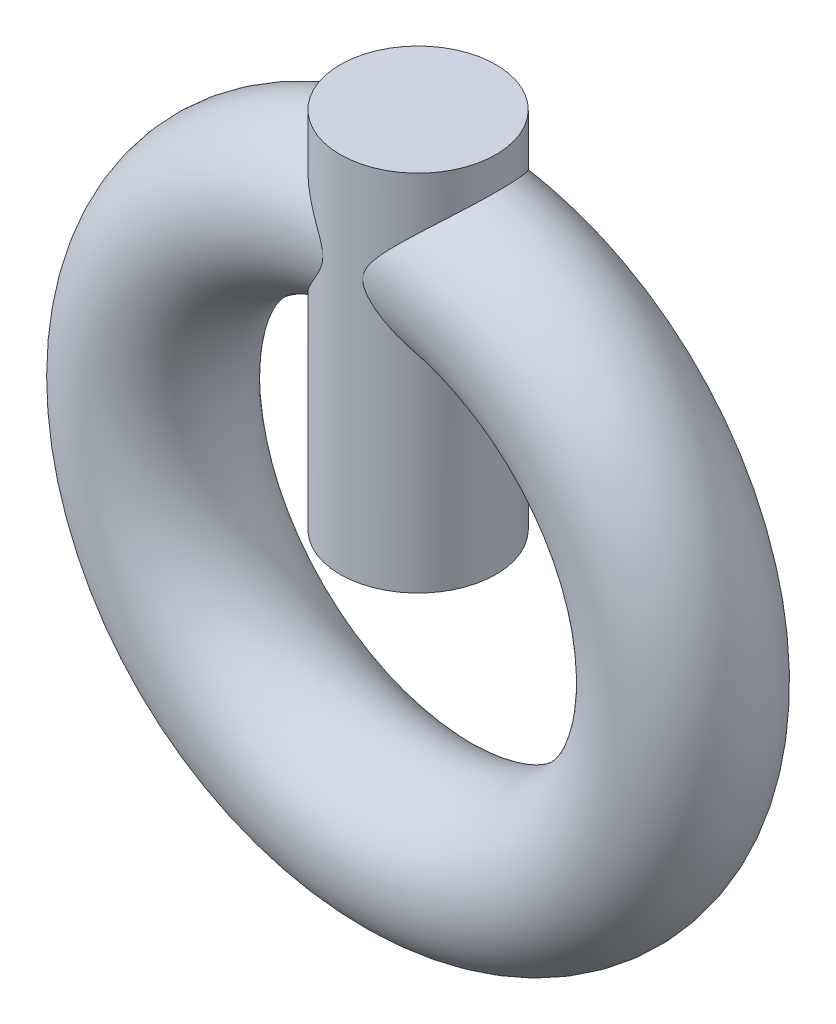
ISO-10303-21;
HEADER;
FILE_DESCRIPTION(('STEP AP214'),'2;1');
FILE_NAME('part.step','',(''),(''),'','','');
FILE_SCHEMA(('AUTOMOTIVE_DESIGN { 1 0 10303 214 1 1 1 1 }'));
ENDSEC;
DATA;
#1=APPLICATION_CONTEXT('core data for automotive mechanical design processes');
#2=APPLICATION_PROTOCOL_DEFINITION('international standard','automotive_design',2000,#1);
#3=PRODUCT_CONTEXT('',#1,'mechanical');
#4=PRODUCT('Part','Part','',(#3));
#5=PRODUCT_RELATED_PRODUCT_CATEGORY('part','',(#4));
#6=PRODUCT_DEFINITION_FORMATION('','',#4);
#7=PRODUCT_DEFINITION_CONTEXT('part definition',#1,'design');
#8=PRODUCT_DEFINITION('design','',#6,#7);
#9=PRODUCT_DEFINITION_SHAPE('','',#8);
#10=(LENGTH_UNIT() NAMED_UNIT(*) SI_UNIT(.MILLI.,.METRE.));
#11=(NAMED_UNIT(*) PLANE_ANGLE_UNIT() SI_UNIT($,.RADIAN.));
#12=(NAMED_UNIT(*) SI_UNIT($,.STERADIAN.) SOLID_ANGLE_UNIT());
#13=UNCERTAINTY_MEASURE_WITH_UNIT(LENGTH_MEASURE(1.E-05),#10,'distance_accuracy_value','');
#14=(GEOMETRIC_REPRESENTATION_CONTEXT(3) GLOBAL_UNCERTAINTY_ASSIGNED_CONTEXT((#13)) GLOBAL_UNIT_ASSIGNED_CONTEXT((#10,
#11,#12)) REPRESENTATION_CONTEXT('',''));
#15=CARTESIAN_POINT('',(0.,0.,0.));
#16=DIRECTION('',(0.,0.,1.));
#17=DIRECTION('',(1.,0.,0.));
#18=AXIS2_PLACEMENT_3D('',#15,#16,#17);
#19=CARTESIAN_POINT('',(0.,7.,0.));
#20=DIRECTION('',(0.,-1.,0.));
#21=DIRECTION('',(0.,0.,-1.));
#22=AXIS2_PLACEMENT_3D('',#19,#20,#21);
#23=CYLINDRICAL_SURFACE('',#22,1.5);
#24=CARTESIAN_POINT('',(1.01046878833553,4.0409402321982,-1.10858145059809));
#25=CARTESIAN_POINT('',(1.04253861403964,3.99718261907201,-1.07934999294081));
#26=CARTESIAN_POINT('',(1.07384523440462,3.95409877128989,-1.04826978071052));
#27=CARTESIAN_POINT('',(1.13460628607274,3.86960763249616,-0.982183834880756));
#28=CARTESIAN_POINT('',(1.16405987732708,3.82820110486405,-0.947176340625828));
#29=CARTESIAN_POINT('',(1.22059699837738,3.74779553809779,-0.873101553256515));
#30=CARTESIAN_POINT('',(1.24768922005671,3.70878784025348,-0.834050416786176));
#31=CARTESIAN_POINT('',(1.29910421629291,3.63387607875015,-0.751459973356823));
#32=CARTESIAN_POINT('',(1.32343021407299,3.59796841491036,-0.707926004961618));
#33=CARTESIAN_POINT('',(1.36717233241729,3.53266373744631,-0.61897616326386));
#34=CARTESIAN_POINT('',(1.38680590927656,3.50299409445297,-0.573871314648189));
#35=CARTESIAN_POINT('',(1.42229648669586,3.44885801260664,-0.479192662383965));
#36=CARTESIAN_POINT('',(1.43815401901551,3.42439084117014,-0.429619489342059));
#37=CARTESIAN_POINT('',(1.4652501338492,3.38228898204289,-0.325525979334886));
#38=CARTESIAN_POINT('',(1.47642311678332,3.36475151717711,-0.270947637754399));
#39=CARTESIAN_POINT('',(1.49264323056097,3.33920592892252,-0.158755897969195));
#40=CARTESIAN_POINT('',(1.49770508959985,3.33117489534948,-0.1011501474275));
#41=CARTESIAN_POINT('',(1.50081675793517,3.32624169756845,0.0066524682189837));
#42=CARTESIAN_POINT('',(1.49974558770159,3.32794438232444,0.0567628636124822));
#43=CARTESIAN_POINT('',(1.49271598914985,3.33907150040854,0.155778231380171));
#44=CARTESIAN_POINT('',(1.48675330751348,3.34850265386789,0.204682116521854));
#45=CARTESIAN_POINT('',(1.46916975711011,3.37612854019577,0.307746404014957));
#46=CARTESIAN_POINT('',(1.45678011802418,3.3955086773874,0.361450054367792));
#47=CARTESIAN_POINT('',(1.42729879779463,3.44114207411111,0.464436649979879));
#48=CARTESIAN_POINT('',(1.41019905549501,3.46740711312146,0.513711822571282));
#49=CARTESIAN_POINT('',(1.36218913682484,3.54026693500417,0.63285053832));
#50=CARTESIAN_POINT('',(1.3287845710363,3.59022073357271,0.699626369605038));
#51=CARTESIAN_POINT('',(1.25580939218595,3.69720074255347,0.823486931462728));
#52=CARTESIAN_POINT('',(1.2162195826254,3.75424885442823,0.88054029432956));
#53=CARTESIAN_POINT('',(1.14020165507297,3.86183045566709,0.976187396833687));
#54=CARTESIAN_POINT('',(1.10453761585232,3.91162426077001,1.01624487969573));
#55=CARTESIAN_POINT('',(1.03074929373401,4.01340587597244,1.09101633250317));
#56=CARTESIAN_POINT('',(0.992623310223478,4.06539519387854,1.12572655150625));
#57=CARTESIAN_POINT('',(0.914596578415572,4.17096369507722,1.18998334285382));
#58=CARTESIAN_POINT('',(0.874699858156463,4.22453918610648,1.21954094980367));
#59=CARTESIAN_POINT('',(0.793737369654664,4.33322827735314,1.27371339437786));
#60=CARTESIAN_POINT('',(0.752672286695242,4.38834097558944,1.29833106387694));
#61=CARTESIAN_POINT('',(0.682443831236421,4.48407605577394,1.33617577841633));
#62=CARTESIAN_POINT('',(0.653302900323194,4.52423580195257,1.35063078134735));
#63=CARTESIAN_POINT('',(0.595573546235822,4.60601698091209,1.37706194425662));
#64=CARTESIAN_POINT('',(0.566987513111327,4.64764319113793,1.38902891400925));
#65=CARTESIAN_POINT('',(0.511593523051117,4.73336489722649,1.41037512069839));
#66=CARTESIAN_POINT('',(0.484808612789477,4.77748253712054,1.41972441031149));
#67=CARTESIAN_POINT('',(0.436848295508783,4.86922579679691,1.43519220043926));
#68=CARTESIAN_POINT('',(0.415629595885699,4.91682042277441,1.44133602671282));
#69=CARTESIAN_POINT('',(0.394648517200486,4.99094852766496,1.44717367666014));
#70=CARTESIAN_POINT('',(0.389464079622309,5.01569040857219,1.44855981809161));
#71=CARTESIAN_POINT('',(0.383790719391989,5.06568688063864,1.45007382699347));
#72=CARTESIAN_POINT('',(0.383280848516008,5.09093867569015,1.4502073080978));
#73=CARTESIAN_POINT('',(0.387246783218786,5.14102272005548,1.44915247756635));
#74=CARTESIAN_POINT('',(0.39172663688343,5.16585461210577,1.44796309271111));
#75=CARTESIAN_POINT('',(0.404778923356229,5.21439448774257,1.44436795339679));
#76=CARTESIAN_POINT('',(0.413372562297466,5.23809593988206,1.44195589233072));
#77=CARTESIAN_POINT('',(0.44045147108063,5.30055702453567,1.43398427057867));
#78=CARTESIAN_POINT('',(0.461617550726551,5.33797888862317,1.42740715569025));
#79=CARTESIAN_POINT('',(0.50776860563708,5.40975540970131,1.41165792971064));
#80=CARTESIAN_POINT('',(0.532766476452404,5.44409906449922,1.40247696340181));
#81=CARTESIAN_POINT('',(0.588832307882073,5.51597373119632,1.3799745375312));
#82=CARTESIAN_POINT('',(0.620226232737413,5.55311454016713,1.36622250010596));
#83=CARTESIAN_POINT('',(0.684017160929136,5.62511897640647,1.33543424856377));
#84=CARTESIAN_POINT('',(0.716415092509567,5.65998039774172,1.31839491427516));
#85=CARTESIAN_POINT('',(0.813836146208785,5.76165852956721,1.26224728366584));
#86=CARTESIAN_POINT('',(0.879092782197021,5.82557645110462,1.21810702475345));
#87=CARTESIAN_POINT('',(1.00914806054986,5.94892888629392,1.11310927424455));
#88=CARTESIAN_POINT('',(1.07373282697846,6.00793664769054,1.05147959003799));
#89=CARTESIAN_POINT('',(1.1940288732644,6.11550355757328,0.912510529122285));
#90=CARTESIAN_POINT('',(1.24976615128358,6.16409347201517,0.83521875840784));
#91=CARTESIAN_POINT('',(1.3317766737739,6.23463996900988,0.693377677009823));
#92=CARTESIAN_POINT('',(1.36176232692155,6.26013742109699,0.63271577123449));
#93=CARTESIAN_POINT('',(1.41384722790436,6.3041405528289,0.505700503683794));
#94=CARTESIAN_POINT('',(1.43595117761222,6.32265040135454,0.439350564540896));
#95=CARTESIAN_POINT('',(1.47095691369422,6.35186055147355,0.302192064529143));
#96=CARTESIAN_POINT('',(1.48380906385969,6.36251873565403,0.231361639745926));
#97=CARTESIAN_POINT('',(1.49916243705733,6.37524276159168,0.0878264392851984));
#98=CARTESIAN_POINT('',(1.50166736378036,6.3773116777975,0.0151223436485165));
#99=CARTESIAN_POINT('',(1.49639365400618,6.37294638520577,-0.123150048565079));
#100=CARTESIAN_POINT('',(1.48950783336577,6.36725043343738,-0.188779059405605));
#101=CARTESIAN_POINT('',(1.46744455834854,6.34892362352945,-0.317612639999553));
#102=CARTESIAN_POINT('',(1.4522670926336,6.336292755907,-0.380817206437626));
#103=CARTESIAN_POINT('',(1.41432890702067,6.30451831940394,-0.503845332178847));
#104=CARTESIAN_POINT('',(1.39149755810574,6.28531405602516,-0.563631094162348));
#105=CARTESIAN_POINT('',(1.33947212592784,6.24116885052487,-0.678063146403836));
#106=CARTESIAN_POINT('',(1.3102765479267,6.2162265606623,-0.732708224968894));
#107=CARTESIAN_POINT('',(1.24292525743342,6.1580371529793,-0.842478980498588));
#108=CARTESIAN_POINT('',(1.20411223243913,6.12414962518685,-0.896858767601806));
#109=CARTESIAN_POINT('',(1.12176442984994,6.0510626276848,-0.997949340205343));
#110=CARTESIAN_POINT('',(1.078224989049,6.01185790220382,-1.04465243537088));
#111=CARTESIAN_POINT('',(0.979202638765597,5.9207417180029,-1.13872577319646));
#112=CARTESIAN_POINT('',(0.923051401031638,5.86784581814892,-1.18443269796039));
#113=CARTESIAN_POINT('',(0.808984305395143,5.75622283830355,-1.26506773161778));
#114=CARTESIAN_POINT('',(0.751070052138143,5.69750095708633,-1.3000053380968));
#115=CARTESIAN_POINT('',(0.663781174100783,5.60262930031203,-1.34557408358497));
#116=CARTESIAN_POINT('',(0.633759690813052,5.56880891160632,-1.35992025830561));
#117=CARTESIAN_POINT('',(0.575094806656246,5.49881881589992,-1.38574373976881));
#118=CARTESIAN_POINT('',(0.5464530649416,5.4626463975579,-1.39721765887217));
#119=CARTESIAN_POINT('',(0.497919915566673,5.3948797852832,-1.4151334840525));
#120=CARTESIAN_POINT('',(0.477436351852244,5.36386029835731,-1.42212453495587));
#121=CARTESIAN_POINT('',(0.440413786312705,5.29915220296771,-1.43401817166338));
#122=CARTESIAN_POINT('',(0.423860370798382,5.26547397077593,-1.43892844236763));
#123=CARTESIAN_POINT('',(0.40321957025092,5.20891643418604,-1.44481250117224));
#124=CARTESIAN_POINT('',(0.396790041606961,5.18700455184718,-1.44657498685335));
#125=CARTESIAN_POINT('',(0.387637332881965,5.14239556449545,-1.44905511518215));
#126=CARTESIAN_POINT('',(0.384902320849967,5.11970120603739,-1.44977609384711));
#127=CARTESIAN_POINT('',(0.383549013683562,5.07412310152138,-1.45013468862462));
#128=CARTESIAN_POINT('',(0.384941756203861,5.05123901114745,-1.44976940003949));
#129=CARTESIAN_POINT('',(0.391415057382162,5.00601363596408,-1.44803495783823));
#130=CARTESIAN_POINT('',(0.396506106908758,4.98367408254566,-1.44666294837748));
#131=CARTESIAN_POINT('',(0.416665843421223,4.9150136462364,-1.44103417870537));
#132=CARTESIAN_POINT('',(0.436497837359111,4.87030110699064,-1.43527110642116));
#133=CARTESIAN_POINT('',(0.481260583117035,4.78389931867754,-1.42090111825563));
#134=CARTESIAN_POINT('',(0.506235151107786,4.74224052510606,-1.41226934397019));
#135=CARTESIAN_POINT('',(0.570408729573469,4.64167018937487,-1.38790966796901));
#136=CARTESIAN_POINT('',(0.610777705257518,4.58384906385797,-1.37075319589499));
#137=CARTESIAN_POINT('',(0.692210479415209,4.47036477671942,-1.33150916506377));
#138=CARTESIAN_POINT('',(0.733275163991783,4.41470471960441,-1.30941479952319));
#139=CARTESIAN_POINT('',(0.814646068008779,4.30507128948699,-1.26039839696526));
#140=CARTESIAN_POINT('',(0.854953096096051,4.25109607218358,-1.23348187287335));
#141=CARTESIAN_POINT('',(0.934013877622121,4.14475100210567,-1.17475340678701));
#142=CARTESIAN_POINT('',(0.97276868815551,4.09238006270171,-1.14294487035145));
#143=CARTESIAN_POINT('',(1.01046878833553,4.0409402321982,-1.10858145059809));
#144=B_SPLINE_CURVE_WITH_KNOTS('',3,(#24,#25,#26,#27,#28,#29,#30,#31,#32,#33,#34,#35,#36,#37,
#38,#39,#40,#41,#42,#43,#44,#45,#46,#47,#48,#49,#50,#51,#52,#53,#54,#55,#56,#57,#58,#59,#60,#61,
#62,#63,#64,#65,#66,#67,#68,#69,#70,#71,#72,#73,#74,#75,#76,#77,#78,#79,#80,#81,#82,#83,#84,#85,
#86,#87,#88,#89,#90,#91,#92,#93,#94,#95,#96,#97,#98,#99,#100,#101,#102,#103,#104,#105,#106,#107,
#108,#109,#110,#111,#112,#113,#114,#115,#116,#117,#118,#119,#120,#121,#122,#123,#124,#125,#126,
#127,#128,#129,#130,#131,#132,#133,#134,#135,#136,#137,#138,#139,#140,#141,#142,#143),
.UNSPECIFIED.,.T.,.F.,(4,2,2,2,2,2,2,2,2,2,2,2,2,2,2,2,2,2,2,2,2,2,2,2,2,2,2,2,2,2,2,2,2,2,2,2,
2,2,2,2,2,2,2,2,2,2,2,2,2,2,2,2,2,2,2,2,2,2,2,4),(0.,0.18483451135902,0.369752220279953,
0.553957674834145,0.737946243616748,0.909859605312586,1.08174874305694,1.25597042822511,
1.4297713844965,1.57934744772391,1.72905370992567,1.90336034258075,2.0779671678583,
2.34598160177373,2.61484500264139,2.83410865306633,3.05352541669133,3.27246635499029,
3.49128142210434,3.64626834830607,3.80181797023892,3.95908050707945,4.11508097242529,
4.19065867825398,4.26589752982835,4.34119746600173,4.41688981529489,4.54665229064468,
4.67686146758075,4.82825021731824,4.97978337254804,5.2828202147976,5.60217479426424,
5.92057285421419,6.13664855826035,6.35259514467154,6.5696918278224,6.78671079652977,
6.98447198230057,7.18223343849377,7.38187248636519,7.58155847318777,7.80546880360376,
8.02960209295866,8.29766465194414,8.56549012259361,8.70771219768636,8.85010123244098,
8.96339661281996,9.07626983589342,9.14471317031584,9.21293678627345,9.28134299727738,
9.34994401550558,9.496532196248,9.64442526254611,9.86180633200133,10.079488925525,
10.296924223681,10.5142088344318),.UNSPECIFIED.);
#145=CARTESIAN_POINT('',(1.01046878833553,4.0409402321982,-1.10858145059809));
#146=VERTEX_POINT('',#145);
#147=EDGE_CURVE('E49',#146,#146,#144,.T.);
#148=ORIENTED_EDGE('',*,*,#147,.T.);
#149=EDGE_LOOP('',(#148));
#150=FACE_BOUND('',#149,.T.);
#151=CARTESIAN_POINT('',(0.,7.,0.));
#152=DIRECTION('',(0.,1.,0.));
#153=DIRECTION('',(0.,0.,1.));
#154=AXIS2_PLACEMENT_3D('',#151,#152,#153);
#155=CIRCLE('',#154,1.5);
#156=CARTESIAN_POINT('',(0.,7.,1.5));
#157=VERTEX_POINT('',#156);
#158=EDGE_CURVE('E54',#157,#157,#155,.T.);
#159=ORIENTED_EDGE('',*,*,#158,.F.);
#160=EDGE_LOOP('',(#159));
#161=FACE_BOUND('',#160,.T.);
#162=CARTESIAN_POINT('',(0.,0.,0.));
#163=DIRECTION('',(0.,1.,0.));
#164=DIRECTION('',(0.,0.,1.));
#165=AXIS2_PLACEMENT_3D('',#162,#163,#164);
#166=CIRCLE('',#165,1.5);
#167=CARTESIAN_POINT('',(0.,0.,1.5));
#168=VERTEX_POINT('',#167);
#169=EDGE_CURVE('E59',#168,#168,#166,.T.);
#170=ORIENTED_EDGE('',*,*,#169,.T.);
#171=EDGE_LOOP('',(#170));
#172=FACE_BOUND('',#171,.T.);
#173=CARTESIAN_POINT('',(-1.40670094637694,3.47264360697196,-0.520759029873025));
#174=CARTESIAN_POINT('',(-1.37598589415619,3.51952581632587,-0.60372982041891));
#175=CARTESIAN_POINT('',(-1.33938743185524,3.57453032981619,-0.680119410954441));
#176=CARTESIAN_POINT('',(-1.27861559745878,3.66382591721945,-0.785369538002927));
#177=CARTESIAN_POINT('',(-1.25727015564447,3.69487733926287,-0.819026830402422));
#178=CARTESIAN_POINT('',(-1.21289311489637,3.75877082427666,-0.883410663902461));
#179=CARTESIAN_POINT('',(-1.18986241857162,3.79161192633699,-0.91413875384436));
#180=CARTESIAN_POINT('',(-1.13125577565576,3.87436716484023,-0.986578348362712));
#181=CARTESIAN_POINT('',(-1.09485237862242,3.92507932373921,-1.02670098406327));
#182=CARTESIAN_POINT('',(-1.01957916358352,4.02868772980737,-1.1014858616387));
#183=CARTESIAN_POINT('',(-0.980707683200886,4.08158544049581,-1.13614436722952));
#184=CARTESIAN_POINT('',(-0.901287550727229,4.18887595958394,-1.20011203824114));
#185=CARTESIAN_POINT('',(-0.860746733119049,4.24326145410377,-1.2294433233834));
#186=CARTESIAN_POINT('',(-0.778567408671285,4.35361262118187,-1.28305526453001));
#187=CARTESIAN_POINT('',(-0.736929569137535,4.40957733452687,-1.30733891452306));
#188=CARTESIAN_POINT('',(-0.666821281154227,4.50561142858459,-1.3440190997644));
#189=CARTESIAN_POINT('',(-0.638321165168138,4.54515468626868,-1.35775402997379));
#190=CARTESIAN_POINT('',(-0.581980014373378,4.62578654954424,-1.38284171162121));
#191=CARTESIAN_POINT('',(-0.554142830446402,4.66688169995577,-1.39418262960133));
#192=CARTESIAN_POINT('',(-0.500419827648201,4.7516974109834,-1.41435748218264));
#193=CARTESIAN_POINT('',(-0.474564396575289,4.79544533971838,-1.42315657911573));
#194=CARTESIAN_POINT('',(-0.429057223534991,4.88652445936708,-1.43751960830203));
#195=CARTESIAN_POINT('',(-0.409344860230598,4.93381452289167,-1.44311564192254));
#196=CARTESIAN_POINT('',(-0.391191379906542,5.00712764251439,-1.4481071226817));
#197=CARTESIAN_POINT('',(-0.38702149709527,5.03149212090303,-1.44921271581231));
#198=CARTESIAN_POINT('',(-0.383329097566496,5.08055508722514,-1.45019411282244));
#199=CARTESIAN_POINT('',(-0.383791570220428,5.10525223752532,-1.4500738888023));
#200=CARTESIAN_POINT('',(-0.389385039818375,5.15398343544631,-1.44858061609037));
#201=CARTESIAN_POINT('',(-0.394504702262769,5.17801894709034,-1.44721060905222));
#202=CARTESIAN_POINT('',(-0.408437677203616,5.22495551213198,-1.44334012392195));
#203=CARTESIAN_POINT('',(-0.41726789988682,5.24785082812078,-1.440834466152));
#204=CARTESIAN_POINT('',(-0.445943919493896,5.31120817621595,-1.43230568856023));
#205=CARTESIAN_POINT('',(-0.468782220456198,5.35010882268295,-1.42510137775347));
#206=CARTESIAN_POINT('',(-0.518281770941282,5.42468937807385,-1.40786611058708));
#207=CARTESIAN_POINT('',(-0.544957297210817,5.46035641000461,-1.3978244567466));
#208=CARTESIAN_POINT('',(-0.603854723418852,5.53405854023888,-1.37350138887399));
#209=CARTESIAN_POINT('',(-0.636337574914747,5.57175614950175,-1.35882912902553));
#210=CARTESIAN_POINT('',(-0.702165165245371,5.64483318655444,-1.32601917817207));
#211=CARTESIAN_POINT('',(-0.735510679014176,5.68021042144019,-1.30787827068569));
#212=CARTESIAN_POINT('',(-0.835500386347627,5.78324921276504,-1.24817378309644));
#213=CARTESIAN_POINT('',(-0.902190035624795,5.84792420291157,-1.20129293850659));
#214=CARTESIAN_POINT('',(-1.02261177701152,5.96114514584796,-1.09984762441161));
#215=CARTESIAN_POINT('',(-1.07690384719137,6.01069524705508,-1.04706265595185));
#216=CARTESIAN_POINT('',(-1.17927116559127,6.10237624194997,-0.930227002154467));
#217=CARTESIAN_POINT('',(-1.22735634270043,6.1445190248608,-0.866194706037364));
#218=CARTESIAN_POINT('',(-1.30642181654135,6.21294092904604,-0.740101773558643));
#219=CARTESIAN_POINT('',(-1.33892235112642,6.24071139667588,-0.67980733600086));
#220=CARTESIAN_POINT('',(-1.39609485878169,6.28920526323996,-0.552946032983248));
#221=CARTESIAN_POINT('',(-1.42076970316073,6.30993124705266,-0.486381479733183));
#222=CARTESIAN_POINT('',(-1.46082959027136,6.34343688433973,-0.348115764990923));
#223=CARTESIAN_POINT('',(-1.476158807377,6.35616879888776,-0.276386543403646));
#224=CARTESIAN_POINT('',(-1.49612685520845,6.37273297981005,-0.130452428929616));
#225=CARTESIAN_POINT('',(-1.50077123692363,6.37656986733977,-0.0562488418637579));
#226=CARTESIAN_POINT('',(-1.49910732615067,6.37519229558631,0.0842654939934383));
#227=CARTESIAN_POINT('',(-1.49387801790344,6.37086952778354,0.150601882337259));
#228=CARTESIAN_POINT('',(-1.4748897728471,6.35511370697104,0.281159399812154));
#229=CARTESIAN_POINT('',(-1.4611312274665,6.34368098025545,0.345380625871011));
#230=CARTESIAN_POINT('',(-1.42597599259883,6.31429264282565,0.469856712876492));
#231=CARTESIAN_POINT('',(-1.40460438831704,6.29635845119938,0.530123839390464));
#232=CARTESIAN_POINT('',(-1.3553445821696,6.25467906817867,0.645751018639134));
#233=CARTESIAN_POINT('',(-1.32745533081402,6.23093294090079,0.701110279113089));
#234=CARTESIAN_POINT('',(-1.26295936946381,6.17543035621624,0.812097643036507));
#235=CARTESIAN_POINT('',(-1.22572551692438,6.14307392653533,0.867058324051198));
#236=CARTESIAN_POINT('',(-1.14635351786946,6.07302850230883,0.969580200579448));
#237=CARTESIAN_POINT('',(-1.10420946953791,6.03533307857484,1.01713232761274));
#238=CARTESIAN_POINT('',(-1.00821180838522,5.94772522834473,1.11308283869497));
#239=CARTESIAN_POINT('',(-0.95366042897812,5.89685517055658,1.15990297729099));
#240=CARTESIAN_POINT('',(-0.842444012078158,5.78950012926375,1.24301377447236));
#241=CARTESIAN_POINT('',(-0.785783614634056,5.73302706387874,1.27932616549507));
#242=CARTESIAN_POINT('',(-0.697712123510163,5.63989687375677,1.32835680939472));
#243=CARTESIAN_POINT('',(-0.666004773481934,5.60526399771395,1.34447869694855));
#244=CARTESIAN_POINT('',(-0.603566086933917,5.53346412770396,1.37364378296027));
#245=CARTESIAN_POINT('',(-0.572841148032725,5.49628412956092,1.3866693880961));
#246=CARTESIAN_POINT('',(-0.51366695990081,5.41821042361457,1.40966752647581));
#247=CARTESIAN_POINT('',(-0.485264671468519,5.37726477642343,1.41958503119557));
#248=CARTESIAN_POINT('',(-0.43544580879524,5.29072753465172,1.43563695083878));
#249=CARTESIAN_POINT('',(-0.413946765029394,5.24520003840186,1.44181687156457));
#250=CARTESIAN_POINT('',(-0.393688730792198,5.17436286576596,1.44743299204048));
#251=CARTESIAN_POINT('',(-0.388916704044979,5.15102396948928,1.44870663131493));
#252=CARTESIAN_POINT('',(-0.383772326444445,5.1038612349983,1.45007788330756));
#253=CARTESIAN_POINT('',(-0.383390454943177,5.08003855844925,1.45017804088921));
#254=CARTESIAN_POINT('',(-0.38689382094342,5.03289422380131,1.44924641028718));
#255=CARTESIAN_POINT('',(-0.390756442856798,5.00957057886371,1.44822062142441));
#256=CARTESIAN_POINT('',(-0.401784496431448,4.96374245632663,1.44519930183956));
#257=CARTESIAN_POINT('',(-0.408962515802515,4.94124145662687,1.44320007363762));
#258=CARTESIAN_POINT('',(-0.429060497805606,4.8879065503288,1.43737780259806));
#259=CARTESIAN_POINT('',(-0.443125219832284,4.85756491306042,1.43314111898308));
#260=CARTESIAN_POINT('',(-0.473738631030253,4.79836418992437,1.42331835096336));
#261=CARTESIAN_POINT('',(-0.490293757200912,4.76950921402501,1.41772874614077));
#262=CARTESIAN_POINT('',(-0.542116275152737,4.68415108947285,1.3990876877774));
#263=CARTESIAN_POINT('',(-0.579347414385391,4.62925753043144,1.38421415171796));
#264=CARTESIAN_POINT('',(-0.660234561625427,4.51418468550982,1.347722497569));
#265=CARTESIAN_POINT('',(-0.7040593124282,4.45434385181579,1.32545101125525));
#266=CARTESIAN_POINT('',(-0.791193408461927,4.33651795204815,1.27536026781236));
#267=CARTESIAN_POINT('',(-0.83450216721335,4.27853489067439,1.24753523737543));
#268=CARTESIAN_POINT('',(-0.919288057028819,4.16460618601113,1.18643679638163));
#269=CARTESIAN_POINT('',(-0.960772757692239,4.10865233402766,1.15318927841187));
#270=CARTESIAN_POINT('',(-1.04137402073786,3.99884755584217,1.08095670555784));
#271=CARTESIAN_POINT('',(-1.08049258145167,3.94499486913482,1.04197659040939));
#272=CARTESIAN_POINT('',(-1.15869869415189,3.83589030070328,0.954531124716341));
#273=CARTESIAN_POINT('',(-1.19754051936395,3.78086299094879,0.905560178150356));
#274=CARTESIAN_POINT('',(-1.27071280042132,3.67553479773889,0.799645249067664));
#275=CARTESIAN_POINT('',(-1.30504422037439,3.62523290487376,0.742702975829929));
#276=CARTESIAN_POINT('',(-1.36102765425688,3.54193917556791,0.63289606248028));
#277=CARTESIAN_POINT('',(-1.38382659522522,3.50753431785294,0.581705710528768));
#278=CARTESIAN_POINT('',(-1.42446516538585,3.44555421025497,0.47351817903257));
#279=CARTESIAN_POINT('',(-1.4423150839384,3.41796480380476,0.416533389055442));
#280=CARTESIAN_POINT('',(-1.4677241956151,3.37839981547326,0.312801201421077));
#281=CARTESIAN_POINT('',(-1.4767532711064,3.36422849649816,0.267262850609572));
#282=CARTESIAN_POINT('',(-1.49061153932552,3.34240858546807,0.174037616612107));
#283=CARTESIAN_POINT('',(-1.49544609764169,3.33475166050333,0.126353560615249));
#284=CARTESIAN_POINT('',(-1.50048273286204,3.32677367777126,0.0298849502084569));
#285=CARTESIAN_POINT('',(-1.50066286319699,3.32648737399681,-0.0189037325509457));
#286=CARTESIAN_POINT('',(-1.49631324788863,3.33337874621295,-0.115759528470907));
#287=CARTESIAN_POINT('',(-1.49177971693877,3.34056242097173,-0.163826030215012));
#288=CARTESIAN_POINT('',(-1.47883456778839,3.36095650969383,-0.255050701304727));
#289=CARTESIAN_POINT('',(-1.47066552814594,3.37378947042715,-0.298331480677013));
#290=CARTESIAN_POINT('',(-1.45110052243043,3.40430463766685,-0.382317580792847));
#291=CARTESIAN_POINT('',(-1.43970667130982,3.42198366570172,-0.423024568190201));
#292=CARTESIAN_POINT('',(-1.42055203823055,3.45145625506504,-0.482148208887693));
#293=CARTESIAN_POINT('',(-1.41378287914491,3.46183403216569,-0.501628554165916));
#294=CARTESIAN_POINT('',(-1.40670094637694,3.47264360697196,-0.520759029873025));
#295=B_SPLINE_CURVE_WITH_KNOTS('',3,(#173,#174,#175,#176,#177,#178,#179,#180,#181,#182,#183,
#184,#185,#186,#187,#188,#189,#190,#191,#192,#193,#194,#195,#196,#197,#198,#199,#200,#201,#202,
#203,#204,#205,#206,#207,#208,#209,#210,#211,#212,#213,#214,#215,#216,#217,#218,#219,#220,#221,
#222,#223,#224,#225,#226,#227,#228,#229,#230,#231,#232,#233,#234,#235,#236,#237,#238,#239,#240,
#241,#242,#243,#244,#245,#246,#247,#248,#249,#250,#251,#252,#253,#254,#255,#256,#257,#258,#259,
#260,#261,#262,#263,#264,#265,#266,#267,#268,#269,#270,#271,#272,#273,#274,#275,#276,#277,#278,
#279,#280,#281,#282,#283,#284,#285,#286,#287,#288,#289,#290,#291,#292,#293,#294),.UNSPECIFIED.,
.T.,.F.,(4,2,2,2,2,2,2,2,2,2,2,2,2,2,2,2,2,2,2,2,2,2,2,2,2,2,2,2,2,2,2,2,2,2,2,2,2,2,2,2,2,2,2,
2,2,2,2,2,2,2,2,2,2,2,2,2,2,2,2,2,4),(0.,0.300305469492196,0.451823448198729,0.603260860819828,
0.825561762773012,1.04801401731991,1.26952036370262,1.49089494700254,1.64276526476946,
1.79536954575171,1.94997566211195,2.10300387796367,2.17684176426058,2.25044046476883,
2.32386052126562,2.39761886831857,2.53390294594858,2.67070786591247,2.82611543115574,
2.98166781112783,3.2923414626739,3.56281002062347,3.83284041406253,4.05367423644349,
4.27442693912494,4.49648569688622,4.71842906452873,4.9175093556773,5.11658051119795,
5.31500169950944,5.51345486020183,5.73418552927096,5.95518429734966,6.21845925733804,
6.48118574736423,6.63000305811815,6.77964676190812,6.93180707630051,7.08207542274994,
7.1532538471788,7.22427788233418,7.29492531288403,7.36584320673404,7.4666996800551,
7.56782146658512,7.77140294176217,8.00353703366984,8.23591371449385,8.46721163646214,
8.69831140604208,8.9476359652485,9.19690714384208,9.39358782862835,9.5898564808371,
9.73490761406786,9.87977292447196,10.025321180094,10.1709864086124,10.3081237593163,
10.4451713777797,10.514412449861),.UNSPECIFIED.);
#296=CARTESIAN_POINT('',(-1.40670094637694,3.47264360697196,-0.520759029873025));
#297=VERTEX_POINT('',#296);
#298=EDGE_CURVE('E10',#297,#297,#295,.T.);
#299=ORIENTED_EDGE('',*,*,#298,.T.);
#300=EDGE_LOOP('',(#299));
#301=FACE_BOUND('',#300,.T.);
#302=ADVANCED_FACE('F37',(#150,#161,#172,#301),#23,.T.);
#303=CARTESIAN_POINT('',(0.,7.,0.));
#304=DIRECTION('',(0.,1.,0.));
#305=DIRECTION('',(0.,0.,1.));
#306=AXIS2_PLACEMENT_3D('',#303,#304,#305);
#307=PLANE('',#306);
#308=ORIENTED_EDGE('',*,*,#158,.T.);
#309=EDGE_LOOP('',(#308));
#310=FACE_BOUND('',#309,.T.);
#311=ADVANCED_FACE('F68',(#310),#307,.T.);
#312=CARTESIAN_POINT('',(0.,0.,0.));
#313=DIRECTION('',(0.,1.,0.));
#314=DIRECTION('',(0.,0.,1.));
#315=AXIS2_PLACEMENT_3D('',#312,#313,#314);
#316=PLANE('',#315);
#317=ORIENTED_EDGE('',*,*,#169,.F.);
#318=EDGE_LOOP('',(#317));
#319=FACE_BOUND('',#318,.T.);
#320=ADVANCED_FACE('F69',(#319),#316,.F.);
#321=CARTESIAN_POINT('',(0.,0.,0.));
#322=DIRECTION('',(0.,0.,1.));
#323=DIRECTION('',(1.,0.,0.));
#324=AXIS2_PLACEMENT_3D('',#321,#322,#323);
#325=TOROIDAL_SURFACE('',#324,5.1,1.45);
#326=ORIENTED_EDGE('',*,*,#147,.F.);
#327=EDGE_LOOP('',(#326));
#328=FACE_BOUND('',#327,.T.);
#329=ORIENTED_EDGE('',*,*,#298,.F.);
#330=EDGE_LOOP('',(#329));
#331=FACE_BOUND('',#330,.T.);
#332=ADVANCED_FACE('F39',(#328,#331),#325,.T.);
#333=CLOSED_SHELL('',(#302,#311,#320,#332));
#334=MANIFOLD_SOLID_BREP('B2',#333);
#335=ADVANCED_BREP_SHAPE_REPRESENTATION('',(#18,#334),#14);
#336=SHAPE_DEFINITION_REPRESENTATION(#9,#335);
ENDSEC;
END-ISO-10303-21;
